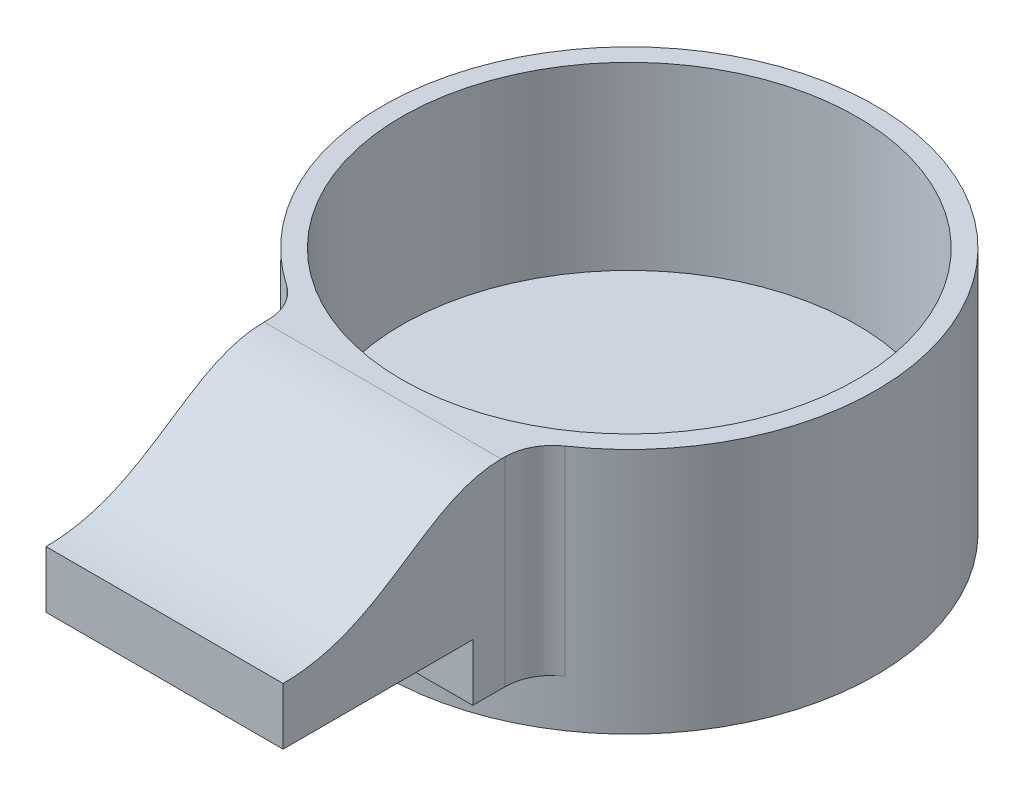
ISO-10303-21;
HEADER;
FILE_DESCRIPTION(('STEP AP214'),'2;1');
FILE_NAME('part.step','',(''),(''),'','','');
FILE_SCHEMA(('AUTOMOTIVE_DESIGN { 1 0 10303 214 1 1 1 1 }'));
ENDSEC;
DATA;
#1=APPLICATION_CONTEXT('core data for automotive mechanical design processes');
#2=APPLICATION_PROTOCOL_DEFINITION('international standard','automotive_design',2000,#1);
#3=PRODUCT_CONTEXT('',#1,'mechanical');
#4=PRODUCT('Part','Part','',(#3));
#5=PRODUCT_RELATED_PRODUCT_CATEGORY('part','',(#4));
#6=PRODUCT_DEFINITION_FORMATION('','',#4);
#7=PRODUCT_DEFINITION_CONTEXT('part definition',#1,'design');
#8=PRODUCT_DEFINITION('design','',#6,#7);
#9=PRODUCT_DEFINITION_SHAPE('','',#8);
#10=(LENGTH_UNIT() NAMED_UNIT(*) SI_UNIT(.MILLI.,.METRE.));
#11=(NAMED_UNIT(*) PLANE_ANGLE_UNIT() SI_UNIT($,.RADIAN.));
#12=(NAMED_UNIT(*) SI_UNIT($,.STERADIAN.) SOLID_ANGLE_UNIT());
#13=UNCERTAINTY_MEASURE_WITH_UNIT(LENGTH_MEASURE(1.E-05),#10,'distance_accuracy_value','');
#14=(GEOMETRIC_REPRESENTATION_CONTEXT(3) GLOBAL_UNCERTAINTY_ASSIGNED_CONTEXT((#13)) GLOBAL_UNIT_ASSIGNED_CONTEXT((#10,
#11,#12)) REPRESENTATION_CONTEXT('',''));
#15=CARTESIAN_POINT('',(0.,0.,0.));
#16=DIRECTION('',(0.,0.,1.));
#17=DIRECTION('',(1.,0.,0.));
#18=AXIS2_PLACEMENT_3D('',#15,#16,#17);
#19=CARTESIAN_POINT('',(0.,0.,0.));
#20=DIRECTION('',(0.,1.,0.));
#21=DIRECTION('',(0.,0.,1.));
#22=AXIS2_PLACEMENT_3D('',#19,#20,#21);
#23=PLANE('',#22);
#24=CARTESIAN_POINT('',(0.,0.,0.));
#25=DIRECTION('',(0.,-1.,0.));
#26=DIRECTION('',(0.,0.,-1.));
#27=AXIS2_PLACEMENT_3D('',#24,#25,#26);
#28=CIRCLE('',#27,26.);
#29=CARTESIAN_POINT('',(14.6774193548387,0.,21.4609729761306));
#30=VERTEX_POINT('',#29);
#31=CARTESIAN_POINT('',(-14.6774193548387,0.,21.4609729761306));
#32=VERTEX_POINT('',#31);
#33=EDGE_CURVE('E132',#30,#32,#28,.T.);
#34=ORIENTED_EDGE('',*,*,#33,.F.);
#35=CARTESIAN_POINT('',(17.5,0.,25.588083163848));
#36=DIRECTION('',(0.,1.,0.));
#37=DIRECTION('',(0.,0.,1.));
#38=AXIS2_PLACEMENT_3D('',#35,#36,#37);
#39=CIRCLE('',#38,5.);
#40=CARTESIAN_POINT('',(12.5,0.,25.588083163848));
#41=VERTEX_POINT('',#40);
#42=EDGE_CURVE('E214',#30,#41,#39,.T.);
#43=ORIENTED_EDGE('',*,*,#42,.T.);
#44=DIRECTION('',(0.,0.,1.));
#45=VECTOR('',#44,1.);
#46=CARTESIAN_POINT('',(12.5,0.,-26.001));
#47=LINE('',#46,#45);
#48=CARTESIAN_POINT('',(12.5,0.,29.));
#49=VERTEX_POINT('',#48);
#50=EDGE_CURVE('E233',#41,#49,#47,.T.);
#51=ORIENTED_EDGE('',*,*,#50,.T.);
#52=DIRECTION('',(1.,0.,0.));
#53=VECTOR('',#52,1.);
#54=CARTESIAN_POINT('',(-12.5,0.,29.));
#55=LINE('',#54,#53);
#56=CARTESIAN_POINT('',(-12.5,0.,29.));
#57=VERTEX_POINT('',#56);
#58=EDGE_CURVE('E144',#57,#49,#55,.T.);
#59=ORIENTED_EDGE('',*,*,#58,.F.);
#60=DIRECTION('',(0.,0.,1.));
#61=VECTOR('',#60,1.);
#62=CARTESIAN_POINT('',(-12.5,0.,-26.001));
#63=LINE('',#62,#61);
#64=CARTESIAN_POINT('',(-12.5,0.,25.588083163848));
#65=VERTEX_POINT('',#64);
#66=EDGE_CURVE('E230',#65,#57,#63,.T.);
#67=ORIENTED_EDGE('',*,*,#66,.F.);
#68=CARTESIAN_POINT('',(-17.5,0.,25.588083163848));
#69=DIRECTION('',(0.,1.,0.));
#70=DIRECTION('',(0.,0.,1.));
#71=AXIS2_PLACEMENT_3D('',#68,#69,#70);
#72=CIRCLE('',#71,5.);
#73=EDGE_CURVE('E43',#65,#32,#72,.T.);
#74=ORIENTED_EDGE('',*,*,#73,.T.);
#75=EDGE_LOOP('',(#34,#43,#51,#59,#67,#74));
#76=FACE_BOUND('',#75,.T.);
#77=ADVANCED_FACE('F35',(#76),#23,.F.);
#78=CARTESIAN_POINT('',(0.,0.,49.));
#79=DIRECTION('',(0.,0.,1.));
#80=DIRECTION('',(1.,0.,0.));
#81=AXIS2_PLACEMENT_3D('',#78,#79,#80);
#82=PLANE('',#81);
#83=DIRECTION('',(0.,-1.,0.));
#84=VECTOR('',#83,1.);
#85=CARTESIAN_POINT('',(-12.5,12.,49.));
#86=LINE('',#85,#84);
#87=CARTESIAN_POINT('',(-12.5,12.,49.));
#88=VERTEX_POINT('',#87);
#89=CARTESIAN_POINT('',(-12.5,6.,49.));
#90=VERTEX_POINT('',#89);
#91=EDGE_CURVE('E259',#88,#90,#86,.T.);
#92=ORIENTED_EDGE('',*,*,#91,.T.);
#93=DIRECTION('',(-1.,0.,0.));
#94=VECTOR('',#93,1.);
#95=CARTESIAN_POINT('',(-12.5,6.,49.));
#96=LINE('',#95,#94);
#97=CARTESIAN_POINT('',(12.5,6.,49.));
#98=VERTEX_POINT('',#97);
#99=EDGE_CURVE('E255',#98,#90,#96,.T.);
#100=ORIENTED_EDGE('',*,*,#99,.F.);
#101=DIRECTION('',(0.,1.,0.));
#102=VECTOR('',#101,1.);
#103=CARTESIAN_POINT('',(12.5,12.,49.));
#104=LINE('',#103,#102);
#105=CARTESIAN_POINT('',(12.5,12.,49.));
#106=VERTEX_POINT('',#105);
#107=EDGE_CURVE('E263',#98,#106,#104,.T.);
#108=ORIENTED_EDGE('',*,*,#107,.T.);
#109=DIRECTION('',(-1.,0.,0.));
#110=VECTOR('',#109,1.);
#111=CARTESIAN_POINT('',(-12.5,12.,49.));
#112=LINE('',#111,#110);
#113=EDGE_CURVE('E128',#106,#88,#112,.T.);
#114=ORIENTED_EDGE('',*,*,#113,.T.);
#115=EDGE_LOOP('',(#92,#100,#108,#114));
#116=FACE_BOUND('',#115,.T.);
#117=ADVANCED_FACE('F173',(#116),#82,.T.);
#118=CARTESIAN_POINT('',(0.,2.,0.));
#119=DIRECTION('',(0.,-1.,0.));
#120=DIRECTION('',(0.,0.,-1.));
#121=AXIS2_PLACEMENT_3D('',#118,#119,#120);
#122=CYLINDRICAL_SURFACE('',#121,26.);
#123=CARTESIAN_POINT('',(0.,21.,0.));
#124=DIRECTION('',(0.,1.,0.));
#125=DIRECTION('',(0.,0.,1.));
#126=AXIS2_PLACEMENT_3D('',#123,#124,#125);
#127=CIRCLE('',#126,26.);
#128=CARTESIAN_POINT('',(14.6774193548387,21.,21.4609729761306));
#129=VERTEX_POINT('',#128);
#130=CARTESIAN_POINT('',(-14.6774193548387,21.,21.4609729761306));
#131=VERTEX_POINT('',#130);
#132=EDGE_CURVE('E221',#129,#131,#127,.T.);
#133=ORIENTED_EDGE('',*,*,#132,.F.);
#134=DIRECTION('',(0.,-1.,0.));
#135=VECTOR('',#134,1.);
#136=CARTESIAN_POINT('',(14.6774193548387,2.,21.4609729761306));
#137=LINE('',#136,#135);
#138=EDGE_CURVE('E219',#129,#30,#137,.T.);
#139=ORIENTED_EDGE('',*,*,#138,.T.);
#140=ORIENTED_EDGE('',*,*,#33,.T.);
#141=DIRECTION('',(0.,-1.,0.));
#142=VECTOR('',#141,1.);
#143=CARTESIAN_POINT('',(-14.6774193548387,2.,21.4609729761306));
#144=LINE('',#143,#142);
#145=EDGE_CURVE('E223',#32,#131,#144,.F.);
#146=ORIENTED_EDGE('',*,*,#145,.T.);
#147=EDGE_LOOP('',(#133,#139,#140,#146));
#148=FACE_BOUND('',#147,.T.);
#149=CARTESIAN_POINT('',(0.,-5.,0.));
#150=DIRECTION('',(0.,-1.,0.));
#151=DIRECTION('',(0.,0.,1.));
#152=AXIS2_PLACEMENT_3D('',#149,#150,#151);
#153=CIRCLE('',#152,26.);
#154=CARTESIAN_POINT('',(0.,-5.,26.));
#155=VERTEX_POINT('',#154);
#156=EDGE_CURVE('E129',#155,#155,#153,.T.);
#157=ORIENTED_EDGE('',*,*,#156,.F.);
#158=EDGE_LOOP('',(#157));
#159=FACE_BOUND('',#158,.T.);
#160=ADVANCED_FACE('F176',(#148,#159),#122,.T.);
#161=CARTESIAN_POINT('',(0.,21.,0.));
#162=DIRECTION('',(0.,1.,0.));
#163=DIRECTION('',(0.,0.,1.));
#164=AXIS2_PLACEMENT_3D('',#161,#162,#163);
#165=PLANE('',#164);
#166=CARTESIAN_POINT('',(0.,21.,0.));
#167=DIRECTION('',(0.,1.,0.));
#168=DIRECTION('',(0.,0.,1.));
#169=AXIS2_PLACEMENT_3D('',#166,#167,#168);
#170=CIRCLE('',#169,24.);
#171=CARTESIAN_POINT('',(0.,21.,24.));
#172=VERTEX_POINT('',#171);
#173=EDGE_CURVE('E232',#172,#172,#170,.T.);
#174=ORIENTED_EDGE('',*,*,#173,.F.);
#175=EDGE_LOOP('',(#174));
#176=FACE_BOUND('',#175,.T.);
#177=DIRECTION('',(0.,0.,1.));
#178=VECTOR('',#177,1.);
#179=CARTESIAN_POINT('',(12.5,21.,26.));
#180=LINE('',#179,#178);
#181=CARTESIAN_POINT('',(12.5,21.,25.588083163848));
#182=VERTEX_POINT('',#181);
#183=CARTESIAN_POINT('',(12.5,21.,26.));
#184=VERTEX_POINT('',#183);
#185=EDGE_CURVE('E107',#182,#184,#180,.T.);
#186=ORIENTED_EDGE('',*,*,#185,.F.);
#187=CARTESIAN_POINT('',(17.5,21.,25.588083163848));
#188=DIRECTION('',(0.,1.,0.));
#189=DIRECTION('',(0.,0.,1.));
#190=AXIS2_PLACEMENT_3D('',#187,#188,#189);
#191=CIRCLE('',#190,5.);
#192=EDGE_CURVE('E225',#182,#129,#191,.F.);
#193=ORIENTED_EDGE('',*,*,#192,.T.);
#194=ORIENTED_EDGE('',*,*,#132,.T.);
#195=CARTESIAN_POINT('',(-17.5,21.,25.588083163848));
#196=DIRECTION('',(0.,1.,0.));
#197=DIRECTION('',(0.,0.,1.));
#198=AXIS2_PLACEMENT_3D('',#195,#196,#197);
#199=CIRCLE('',#198,5.);
#200=CARTESIAN_POINT('',(-12.5,21.,25.588083163848));
#201=VERTEX_POINT('',#200);
#202=EDGE_CURVE('E11',#131,#201,#199,.F.);
#203=ORIENTED_EDGE('',*,*,#202,.T.);
#204=DIRECTION('',(0.,0.,1.));
#205=VECTOR('',#204,1.);
#206=CARTESIAN_POINT('',(-12.5,21.,26.));
#207=LINE('',#206,#205);
#208=CARTESIAN_POINT('',(-12.5,21.,26.));
#209=VERTEX_POINT('',#208);
#210=EDGE_CURVE('E116',#201,#209,#207,.T.);
#211=ORIENTED_EDGE('',*,*,#210,.T.);
#212=DIRECTION('',(1.,0.,0.));
#213=VECTOR('',#212,1.);
#214=CARTESIAN_POINT('',(-40.2045741606889,21.,26.));
#215=LINE('',#214,#213);
#216=EDGE_CURVE('E119',#209,#184,#215,.T.);
#217=ORIENTED_EDGE('',*,*,#216,.T.);
#218=EDGE_LOOP('',(#186,#193,#194,#203,#211,#217));
#219=FACE_BOUND('',#218,.T.);
#220=ADVANCED_FACE('F120',(#176,#219),#165,.T.);
#221=CARTESIAN_POINT('',(0.,21.,0.));
#222=DIRECTION('',(0.,-1.,0.));
#223=DIRECTION('',(0.,0.,-1.));
#224=AXIS2_PLACEMENT_3D('',#221,#222,#223);
#225=CYLINDRICAL_SURFACE('',#224,24.);
#226=ORIENTED_EDGE('',*,*,#173,.T.);
#227=EDGE_LOOP('',(#226));
#228=FACE_BOUND('',#227,.T.);
#229=CARTESIAN_POINT('',(0.,2.,0.));
#230=DIRECTION('',(0.,1.,0.));
#231=DIRECTION('',(0.,0.,1.));
#232=AXIS2_PLACEMENT_3D('',#229,#230,#231);
#233=CIRCLE('',#232,24.);
#234=CARTESIAN_POINT('',(0.,2.,24.));
#235=VERTEX_POINT('',#234);
#236=EDGE_CURVE('E243',#235,#235,#233,.F.);
#237=ORIENTED_EDGE('',*,*,#236,.T.);
#238=EDGE_LOOP('',(#237));
#239=FACE_BOUND('',#238,.T.);
#240=ADVANCED_FACE('F184',(#228,#239),#225,.F.);
#241=CARTESIAN_POINT('',(0.,2.,0.));
#242=DIRECTION('',(0.,1.,0.));
#243=DIRECTION('',(0.,0.,1.));
#244=AXIS2_PLACEMENT_3D('',#241,#242,#243);
#245=PLANE('',#244);
#246=ORIENTED_EDGE('',*,*,#236,.F.);
#247=EDGE_LOOP('',(#246));
#248=FACE_BOUND('',#247,.T.);
#249=ADVANCED_FACE('F180',(#248),#245,.T.);
#250=CARTESIAN_POINT('',(12.5,12.,-26.001));
#251=DIRECTION('',(1.,0.,0.));
#252=DIRECTION('',(0.,1.,0.));
#253=AXIS2_PLACEMENT_3D('',#250,#251,#252);
#254=PLANE('',#253);
#255=ORIENTED_EDGE('',*,*,#50,.F.);
#256=DIRECTION('',(0.,-1.,0.));
#257=VECTOR('',#256,1.);
#258=CARTESIAN_POINT('',(12.5,12.,25.588083163848));
#259=LINE('',#258,#257);
#260=EDGE_CURVE('E115',#41,#182,#259,.F.);
#261=ORIENTED_EDGE('',*,*,#260,.T.);
#262=ORIENTED_EDGE('',*,*,#185,.T.);
#263=CARTESIAN_POINT('',(12.5,21.,26.));
#264=CARTESIAN_POINT('',(12.5,21.,34.1298505583696));
#265=CARTESIAN_POINT('',(12.5,12.,38.3412929391669));
#266=CARTESIAN_POINT('',(12.5,12.,49.));
#267=B_SPLINE_CURVE_WITH_KNOTS('',3,(#263,#264,#265,#266),.UNSPECIFIED.,.F.,.F.,(4,4),(0.,1.),.UNSPECIFIED.);
#268=EDGE_CURVE('E113',#184,#106,#267,.T.);
#269=ORIENTED_EDGE('',*,*,#268,.T.);
#270=ORIENTED_EDGE('',*,*,#107,.F.);
#271=DIRECTION('',(0.,0.,1.));
#272=VECTOR('',#271,1.);
#273=CARTESIAN_POINT('',(12.5,6.,49.));
#274=LINE('',#273,#272);
#275=CARTESIAN_POINT('',(12.5,6.,29.));
#276=VERTEX_POINT('',#275);
#277=EDGE_CURVE('E277',#276,#98,#274,.T.);
#278=ORIENTED_EDGE('',*,*,#277,.F.);
#279=DIRECTION('',(0.,-1.,0.));
#280=VECTOR('',#279,1.);
#281=CARTESIAN_POINT('',(12.5,6.,29.));
#282=LINE('',#281,#280);
#283=EDGE_CURVE('E257',#276,#49,#282,.T.);
#284=ORIENTED_EDGE('',*,*,#283,.T.);
#285=EDGE_LOOP('',(#255,#261,#262,#269,#270,#278,#284));
#286=FACE_BOUND('',#285,.T.);
#287=ADVANCED_FACE('F110',(#286),#254,.T.);
#288=CARTESIAN_POINT('',(-12.5,12.,-26.001));
#289=DIRECTION('',(-1.,0.,0.));
#290=DIRECTION('',(0.,-1.,0.));
#291=AXIS2_PLACEMENT_3D('',#288,#289,#290);
#292=PLANE('',#291);
#293=ORIENTED_EDGE('',*,*,#210,.F.);
#294=DIRECTION('',(0.,-1.,0.));
#295=VECTOR('',#294,1.);
#296=CARTESIAN_POINT('',(-12.5,12.,25.588083163848));
#297=LINE('',#296,#295);
#298=EDGE_CURVE('E222',#201,#65,#297,.T.);
#299=ORIENTED_EDGE('',*,*,#298,.T.);
#300=ORIENTED_EDGE('',*,*,#66,.T.);
#301=DIRECTION('',(0.,-1.,0.));
#302=VECTOR('',#301,1.);
#303=CARTESIAN_POINT('',(-12.5,6.,29.));
#304=LINE('',#303,#302);
#305=CARTESIAN_POINT('',(-12.5,6.,29.));
#306=VERTEX_POINT('',#305);
#307=EDGE_CURVE('E260',#306,#57,#304,.T.);
#308=ORIENTED_EDGE('',*,*,#307,.F.);
#309=DIRECTION('',(0.,0.,-1.));
#310=VECTOR('',#309,1.);
#311=CARTESIAN_POINT('',(-12.5,6.,49.));
#312=LINE('',#311,#310);
#313=EDGE_CURVE('E153',#90,#306,#312,.T.);
#314=ORIENTED_EDGE('',*,*,#313,.F.);
#315=ORIENTED_EDGE('',*,*,#91,.F.);
#316=CARTESIAN_POINT('',(-12.5,21.,26.));
#317=CARTESIAN_POINT('',(-12.5,21.,34.1298505583696));
#318=CARTESIAN_POINT('',(-12.5,12.,38.3412929391669));
#319=CARTESIAN_POINT('',(-12.5,12.,49.));
#320=B_SPLINE_CURVE_WITH_KNOTS('',3,(#316,#317,#318,#319),.UNSPECIFIED.,.F.,.F.,(4,4),(0.,1.),.UNSPECIFIED.);
#321=EDGE_CURVE('E124',#209,#88,#320,.T.);
#322=ORIENTED_EDGE('',*,*,#321,.F.);
#323=EDGE_LOOP('',(#293,#299,#300,#308,#314,#315,#322));
#324=FACE_BOUND('',#323,.T.);
#325=ADVANCED_FACE('F171',(#324),#292,.T.);
#326=CARTESIAN_POINT('',(-12.5,6.,29.));
#327=DIRECTION('',(0.,0.,-1.));
#328=DIRECTION('',(-1.,0.,0.));
#329=AXIS2_PLACEMENT_3D('',#326,#327,#328);
#330=PLANE('',#329);
#331=ORIENTED_EDGE('',*,*,#58,.T.);
#332=ORIENTED_EDGE('',*,*,#283,.F.);
#333=DIRECTION('',(1.,0.,0.));
#334=VECTOR('',#333,1.);
#335=CARTESIAN_POINT('',(-12.5,6.,29.));
#336=LINE('',#335,#334);
#337=EDGE_CURVE('E252',#306,#276,#336,.T.);
#338=ORIENTED_EDGE('',*,*,#337,.F.);
#339=ORIENTED_EDGE('',*,*,#307,.T.);
#340=EDGE_LOOP('',(#331,#332,#338,#339));
#341=FACE_BOUND('',#340,.T.);
#342=ADVANCED_FACE('F167',(#341),#330,.F.);
#343=CARTESIAN_POINT('',(0.,6.,0.));
#344=DIRECTION('',(0.,-1.,0.));
#345=DIRECTION('',(0.,0.,-1.));
#346=AXIS2_PLACEMENT_3D('',#343,#344,#345);
#347=PLANE('',#346);
#348=ORIENTED_EDGE('',*,*,#313,.T.);
#349=ORIENTED_EDGE('',*,*,#337,.T.);
#350=ORIENTED_EDGE('',*,*,#277,.T.);
#351=ORIENTED_EDGE('',*,*,#99,.T.);
#352=EDGE_LOOP('',(#348,#349,#350,#351));
#353=FACE_BOUND('',#352,.T.);
#354=ADVANCED_FACE('F163',(#353),#347,.T.);
#355=CARTESIAN_POINT('',(-40.2045741606889,21.,26.));
#356=CARTESIAN_POINT('',(-40.2045741606889,21.,34.1298505583696));
#357=CARTESIAN_POINT('',(-40.2045741606889,12.,38.3412929391669));
#358=CARTESIAN_POINT('',(-40.2045741606889,12.,49.));
#359=B_SPLINE_CURVE_WITH_KNOTS('',3,(#355,#356,#357,#358),.UNSPECIFIED.,.F.,.F.,(4,4),(0.,1.),.UNSPECIFIED.);
#360=DIRECTION('',(1.,0.,0.));
#361=VECTOR('',#360,1.);
#362=SURFACE_OF_LINEAR_EXTRUSION('',#359,#361);
#363=ORIENTED_EDGE('',*,*,#216,.F.);
#364=ORIENTED_EDGE('',*,*,#321,.T.);
#365=ORIENTED_EDGE('',*,*,#113,.F.);
#366=ORIENTED_EDGE('',*,*,#268,.F.);
#367=EDGE_LOOP('',(#363,#364,#365,#366));
#368=FACE_BOUND('',#367,.T.);
#369=ADVANCED_FACE('F127',(#368),#362,.T.);
#370=CARTESIAN_POINT('',(0.,-5.,0.));
#371=DIRECTION('',(0.,1.,0.));
#372=DIRECTION('',(0.,0.,1.));
#373=AXIS2_PLACEMENT_3D('',#370,#371,#372);
#374=PLANE('',#373);
#375=ORIENTED_EDGE('',*,*,#156,.T.);
#376=EDGE_LOOP('',(#375));
#377=FACE_BOUND('',#376,.T.);
#378=CARTESIAN_POINT('',(0.,-5.,0.));
#379=DIRECTION('',(0.,-1.,0.));
#380=DIRECTION('',(0.,0.,-1.));
#381=AXIS2_PLACEMENT_3D('',#378,#379,#380);
#382=CIRCLE('',#381,24.);
#383=CARTESIAN_POINT('',(0.,-5.,-24.));
#384=VERTEX_POINT('',#383);
#385=EDGE_CURVE('E216',#384,#384,#382,.T.);
#386=ORIENTED_EDGE('',*,*,#385,.F.);
#387=EDGE_LOOP('',(#386));
#388=FACE_BOUND('',#387,.T.);
#389=ADVANCED_FACE('F162',(#377,#388),#374,.F.);
#390=CARTESIAN_POINT('',(0.,-5.,0.));
#391=DIRECTION('',(0.,1.,0.));
#392=DIRECTION('',(0.,0.,1.));
#393=AXIS2_PLACEMENT_3D('',#390,#391,#392);
#394=CYLINDRICAL_SURFACE('',#393,24.);
#395=ORIENTED_EDGE('',*,*,#385,.T.);
#396=EDGE_LOOP('',(#395));
#397=FACE_BOUND('',#396,.T.);
#398=CARTESIAN_POINT('',(0.,0.,0.));
#399=DIRECTION('',(0.,-1.,0.));
#400=DIRECTION('',(0.,0.,-1.));
#401=AXIS2_PLACEMENT_3D('',#398,#399,#400);
#402=CIRCLE('',#401,24.);
#403=CARTESIAN_POINT('',(0.,0.,-24.));
#404=VERTEX_POINT('',#403);
#405=EDGE_CURVE('E279',#404,#404,#402,.T.);
#406=ORIENTED_EDGE('',*,*,#405,.F.);
#407=EDGE_LOOP('',(#406));
#408=FACE_BOUND('',#407,.T.);
#409=ADVANCED_FACE('F198',(#397,#408),#394,.F.);
#410=ORIENTED_EDGE('',*,*,#405,.T.);
#411=EDGE_LOOP('',(#410));
#412=FACE_BOUND('',#411,.T.);
#413=ADVANCED_FACE('F194',(#412),#23,.F.);
#414=CARTESIAN_POINT('',(17.5,2.00000000000001,25.588083163848));
#415=DIRECTION('',(0.,-1.,0.));
#416=DIRECTION('',(0.,0.,-1.));
#417=AXIS2_PLACEMENT_3D('',#414,#415,#416);
#418=CYLINDRICAL_SURFACE('',#417,5.);
#419=ORIENTED_EDGE('',*,*,#42,.F.);
#420=ORIENTED_EDGE('',*,*,#138,.F.);
#421=ORIENTED_EDGE('',*,*,#192,.F.);
#422=ORIENTED_EDGE('',*,*,#260,.F.);
#423=EDGE_LOOP('',(#419,#420,#421,#422));
#424=FACE_BOUND('',#423,.T.);
#425=ADVANCED_FACE('F197',(#424),#418,.F.);
#426=CARTESIAN_POINT('',(-17.5,2.,25.588083163848));
#427=DIRECTION('',(0.,-1.,0.));
#428=DIRECTION('',(0.,0.,-1.));
#429=AXIS2_PLACEMENT_3D('',#426,#427,#428);
#430=CYLINDRICAL_SURFACE('',#429,5.);
#431=ORIENTED_EDGE('',*,*,#202,.F.);
#432=ORIENTED_EDGE('',*,*,#145,.F.);
#433=ORIENTED_EDGE('',*,*,#73,.F.);
#434=ORIENTED_EDGE('',*,*,#298,.F.);
#435=EDGE_LOOP('',(#431,#432,#433,#434));
#436=FACE_BOUND('',#435,.T.);
#437=ADVANCED_FACE('F37',(#436),#430,.F.);
#438=CLOSED_SHELL('',(#77,#117,#160,#220,#240,#249,#287,#325,#342,#354,#369,#389,#409,#413,#425,#437));
#439=MANIFOLD_SOLID_BREP('B2',#438);
#440=ADVANCED_BREP_SHAPE_REPRESENTATION('',(#18,#439),#14);
#441=SHAPE_DEFINITION_REPRESENTATION(#9,#440);
ENDSEC;
END-ISO-10303-21;
